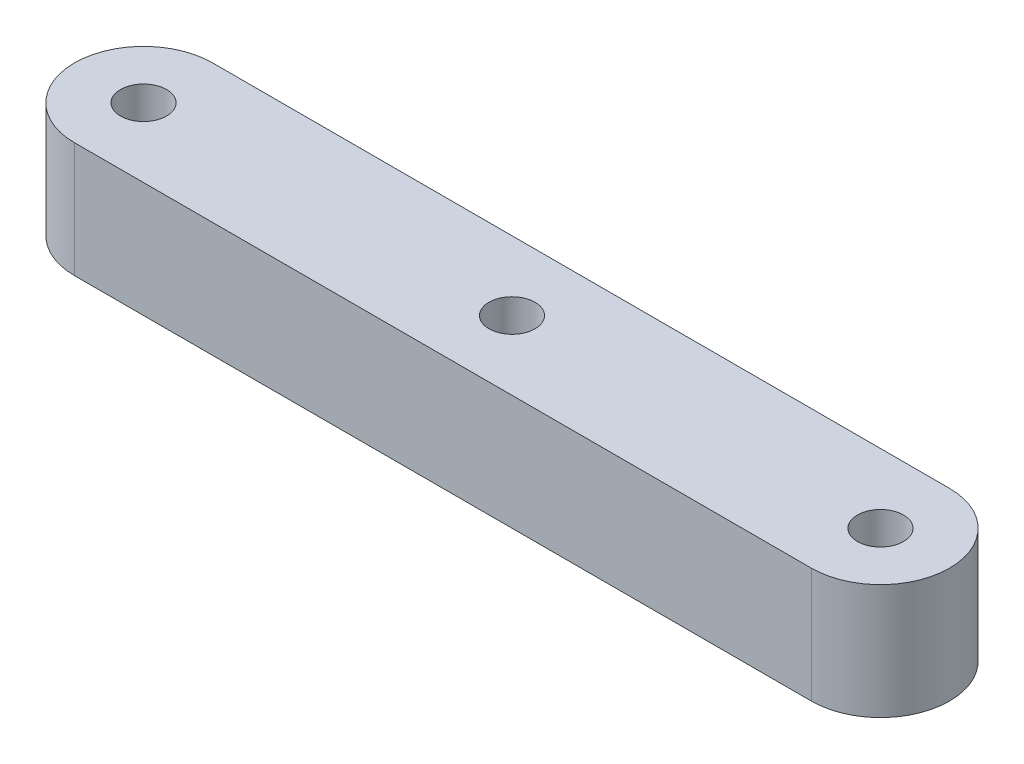
ISO-10303-21;
HEADER;
FILE_DESCRIPTION(('STEP AP214'),'2;1');
FILE_NAME('part.step','',(''),(''),'','','');
FILE_SCHEMA(('AUTOMOTIVE_DESIGN { 1 0 10303 214 1 1 1 1 }'));
ENDSEC;
DATA;
#1=APPLICATION_CONTEXT('core data for automotive mechanical design processes');
#2=APPLICATION_PROTOCOL_DEFINITION('international standard','automotive_design',2000,#1);
#3=PRODUCT_CONTEXT('',#1,'mechanical');
#4=PRODUCT('Part','Part','',(#3));
#5=PRODUCT_RELATED_PRODUCT_CATEGORY('part','',(#4));
#6=PRODUCT_DEFINITION_FORMATION('','',#4);
#7=PRODUCT_DEFINITION_CONTEXT('part definition',#1,'design');
#8=PRODUCT_DEFINITION('design','',#6,#7);
#9=PRODUCT_DEFINITION_SHAPE('','',#8);
#10=(LENGTH_UNIT() NAMED_UNIT(*) SI_UNIT(.MILLI.,.METRE.));
#11=(NAMED_UNIT(*) PLANE_ANGLE_UNIT() SI_UNIT($,.RADIAN.));
#12=(NAMED_UNIT(*) SI_UNIT($,.STERADIAN.) SOLID_ANGLE_UNIT());
#13=UNCERTAINTY_MEASURE_WITH_UNIT(LENGTH_MEASURE(1.E-05),#10,'distance_accuracy_value','');
#14=(GEOMETRIC_REPRESENTATION_CONTEXT(3) GLOBAL_UNCERTAINTY_ASSIGNED_CONTEXT((#13)) GLOBAL_UNIT_ASSIGNED_CONTEXT((#10,
#11,#12)) REPRESENTATION_CONTEXT('',''));
#15=CARTESIAN_POINT('',(0.,0.,0.));
#16=DIRECTION('',(0.,0.,1.));
#17=DIRECTION('',(1.,0.,0.));
#18=AXIS2_PLACEMENT_3D('',#15,#16,#17);
#19=CARTESIAN_POINT('',(-50.8,12.7,0.));
#20=DIRECTION('',(0.,-1.,0.));
#21=DIRECTION('',(0.,0.,-1.));
#22=AXIS2_PLACEMENT_3D('',#19,#20,#21);
#23=CYLINDRICAL_SURFACE('',#22,7.62);
#24=CARTESIAN_POINT('',(-50.8,0.,0.));
#25=DIRECTION('',(0.,1.,0.));
#26=DIRECTION('',(0.,0.,1.));
#27=AXIS2_PLACEMENT_3D('',#24,#25,#26);
#28=CIRCLE('',#27,7.62);
#29=CARTESIAN_POINT('',(-50.8,0.,-7.62));
#30=VERTEX_POINT('',#29);
#31=CARTESIAN_POINT('',(-50.8,0.,7.62));
#32=VERTEX_POINT('',#31);
#33=EDGE_CURVE('E102',#30,#32,#28,.T.);
#34=ORIENTED_EDGE('',*,*,#33,.T.);
#35=DIRECTION('',(0.,-1.,0.));
#36=VECTOR('',#35,1.);
#37=CARTESIAN_POINT('',(-50.8,12.7,7.62));
#38=LINE('',#37,#36);
#39=CARTESIAN_POINT('',(-50.8,12.7,7.62));
#40=VERTEX_POINT('',#39);
#41=EDGE_CURVE('E11',#40,#32,#38,.T.);
#42=ORIENTED_EDGE('',*,*,#41,.F.);
#43=CARTESIAN_POINT('',(-50.8,12.7,0.));
#44=DIRECTION('',(0.,1.,0.));
#45=DIRECTION('',(0.,0.,1.));
#46=AXIS2_PLACEMENT_3D('',#43,#44,#45);
#47=CIRCLE('',#46,7.62);
#48=CARTESIAN_POINT('',(-50.8,12.7,-7.62));
#49=VERTEX_POINT('',#48);
#50=EDGE_CURVE('E90',#49,#40,#47,.T.);
#51=ORIENTED_EDGE('',*,*,#50,.F.);
#52=DIRECTION('',(0.,-1.,0.));
#53=VECTOR('',#52,1.);
#54=CARTESIAN_POINT('',(-50.8,12.7,-7.62));
#55=LINE('',#54,#53);
#56=EDGE_CURVE('E98',#49,#30,#55,.T.);
#57=ORIENTED_EDGE('',*,*,#56,.T.);
#58=EDGE_LOOP('',(#34,#42,#51,#57));
#59=FACE_BOUND('',#58,.T.);
#60=ADVANCED_FACE('F39',(#59),#23,.T.);
#61=CARTESIAN_POINT('',(-50.8,12.7,7.62));
#62=DIRECTION('',(0.,0.,-1.));
#63=DIRECTION('',(-1.,0.,0.));
#64=AXIS2_PLACEMENT_3D('',#61,#62,#63);
#65=PLANE('',#64);
#66=DIRECTION('',(1.,0.,0.));
#67=VECTOR('',#66,1.);
#68=CARTESIAN_POINT('',(-50.8,0.,7.62));
#69=LINE('',#68,#67);
#70=CARTESIAN_POINT('',(30.48,0.,7.62));
#71=VERTEX_POINT('',#70);
#72=EDGE_CURVE('E94',#32,#71,#69,.T.);
#73=ORIENTED_EDGE('',*,*,#72,.T.);
#74=DIRECTION('',(0.,-1.,0.));
#75=VECTOR('',#74,1.);
#76=CARTESIAN_POINT('',(30.48,12.7,7.62));
#77=LINE('',#76,#75);
#78=CARTESIAN_POINT('',(30.48,12.7,7.62));
#79=VERTEX_POINT('',#78);
#80=EDGE_CURVE('E47',#79,#71,#77,.T.);
#81=ORIENTED_EDGE('',*,*,#80,.F.);
#82=DIRECTION('',(1.,0.,0.));
#83=VECTOR('',#82,1.);
#84=CARTESIAN_POINT('',(-50.8,12.7,7.62));
#85=LINE('',#84,#83);
#86=EDGE_CURVE('E85',#40,#79,#85,.T.);
#87=ORIENTED_EDGE('',*,*,#86,.F.);
#88=ORIENTED_EDGE('',*,*,#41,.T.);
#89=EDGE_LOOP('',(#73,#81,#87,#88));
#90=FACE_BOUND('',#89,.T.);
#91=ADVANCED_FACE('F93',(#90),#65,.F.);
#92=CARTESIAN_POINT('',(30.48,12.7,0.));
#93=DIRECTION('',(0.,-1.,0.));
#94=DIRECTION('',(0.,0.,-1.));
#95=AXIS2_PLACEMENT_3D('',#92,#93,#94);
#96=CYLINDRICAL_SURFACE('',#95,7.62);
#97=CARTESIAN_POINT('',(30.48,0.,0.));
#98=DIRECTION('',(0.,1.,0.));
#99=DIRECTION('',(0.,0.,1.));
#100=AXIS2_PLACEMENT_3D('',#97,#98,#99);
#101=CIRCLE('',#100,7.62);
#102=CARTESIAN_POINT('',(30.48,0.,-7.62));
#103=VERTEX_POINT('',#102);
#104=EDGE_CURVE('E72',#71,#103,#101,.T.);
#105=ORIENTED_EDGE('',*,*,#104,.T.);
#106=DIRECTION('',(0.,-1.,0.));
#107=VECTOR('',#106,1.);
#108=CARTESIAN_POINT('',(30.48,12.7,-7.62));
#109=LINE('',#108,#107);
#110=CARTESIAN_POINT('',(30.48,12.7,-7.62));
#111=VERTEX_POINT('',#110);
#112=EDGE_CURVE('E95',#111,#103,#109,.T.);
#113=ORIENTED_EDGE('',*,*,#112,.F.);
#114=CARTESIAN_POINT('',(30.48,12.7,0.));
#115=DIRECTION('',(0.,1.,0.));
#116=DIRECTION('',(0.,0.,1.));
#117=AXIS2_PLACEMENT_3D('',#114,#115,#116);
#118=CIRCLE('',#117,7.62);
#119=EDGE_CURVE('E88',#79,#111,#118,.T.);
#120=ORIENTED_EDGE('',*,*,#119,.F.);
#121=ORIENTED_EDGE('',*,*,#80,.T.);
#122=EDGE_LOOP('',(#105,#113,#120,#121));
#123=FACE_BOUND('',#122,.T.);
#124=ADVANCED_FACE('F96',(#123),#96,.T.);
#125=CARTESIAN_POINT('',(-50.8,12.7,-7.62));
#126=DIRECTION('',(0.,0.,1.));
#127=DIRECTION('',(1.,0.,0.));
#128=AXIS2_PLACEMENT_3D('',#125,#126,#127);
#129=PLANE('',#128);
#130=DIRECTION('',(-1.,0.,0.));
#131=VECTOR('',#130,1.);
#132=CARTESIAN_POINT('',(-50.8,0.,-7.62));
#133=LINE('',#132,#131);
#134=EDGE_CURVE('E78',#103,#30,#133,.T.);
#135=ORIENTED_EDGE('',*,*,#134,.T.);
#136=ORIENTED_EDGE('',*,*,#56,.F.);
#137=DIRECTION('',(-1.,0.,0.));
#138=VECTOR('',#137,1.);
#139=CARTESIAN_POINT('',(-50.8,12.7,-7.62));
#140=LINE('',#139,#138);
#141=EDGE_CURVE('E55',#111,#49,#140,.T.);
#142=ORIENTED_EDGE('',*,*,#141,.F.);
#143=ORIENTED_EDGE('',*,*,#112,.T.);
#144=EDGE_LOOP('',(#135,#136,#142,#143));
#145=FACE_BOUND('',#144,.T.);
#146=ADVANCED_FACE('F110',(#145),#129,.F.);
#147=CARTESIAN_POINT('',(-50.8,12.7,0.));
#148=DIRECTION('',(0.,1.,0.));
#149=DIRECTION('',(0.,0.,1.));
#150=AXIS2_PLACEMENT_3D('',#147,#148,#149);
#151=PLANE('',#150);
#152=CARTESIAN_POINT('',(-50.8,12.7,0.));
#153=DIRECTION('',(0.,1.,0.));
#154=DIRECTION('',(0.,0.,1.));
#155=AXIS2_PLACEMENT_3D('',#152,#153,#154);
#156=CIRCLE('',#155,2.54);
#157=CARTESIAN_POINT('',(-50.8,12.7,2.54));
#158=VERTEX_POINT('',#157);
#159=EDGE_CURVE('E128',#158,#158,#156,.T.);
#160=ORIENTED_EDGE('',*,*,#159,.F.);
#161=EDGE_LOOP('',(#160));
#162=FACE_BOUND('',#161,.T.);
#163=CARTESIAN_POINT('',(30.48,12.7,0.));
#164=DIRECTION('',(0.,1.,0.));
#165=DIRECTION('',(0.,0.,-1.));
#166=AXIS2_PLACEMENT_3D('',#163,#164,#165);
#167=CIRCLE('',#166,2.54);
#168=CARTESIAN_POINT('',(30.48,12.7,-2.54));
#169=VERTEX_POINT('',#168);
#170=EDGE_CURVE('E125',#169,#169,#167,.T.);
#171=ORIENTED_EDGE('',*,*,#170,.F.);
#172=EDGE_LOOP('',(#171));
#173=FACE_BOUND('',#172,.T.);
#174=CARTESIAN_POINT('',(-10.16,12.7,0.));
#175=DIRECTION('',(0.,1.,0.));
#176=DIRECTION('',(0.,0.,1.));
#177=AXIS2_PLACEMENT_3D('',#174,#175,#176);
#178=CIRCLE('',#177,2.54);
#179=CARTESIAN_POINT('',(-10.16,12.7,2.54));
#180=VERTEX_POINT('',#179);
#181=EDGE_CURVE('E119',#180,#180,#178,.T.);
#182=ORIENTED_EDGE('',*,*,#181,.F.);
#183=EDGE_LOOP('',(#182));
#184=FACE_BOUND('',#183,.T.);
#185=ORIENTED_EDGE('',*,*,#50,.T.);
#186=ORIENTED_EDGE('',*,*,#86,.T.);
#187=ORIENTED_EDGE('',*,*,#119,.T.);
#188=ORIENTED_EDGE('',*,*,#141,.T.);
#189=EDGE_LOOP('',(#185,#186,#187,#188));
#190=FACE_BOUND('',#189,.T.);
#191=ADVANCED_FACE('F86',(#162,#173,#184,#190),#151,.T.);
#192=CARTESIAN_POINT('',(-50.8,0.,0.));
#193=DIRECTION('',(0.,1.,0.));
#194=DIRECTION('',(0.,0.,1.));
#195=AXIS2_PLACEMENT_3D('',#192,#193,#194);
#196=PLANE('',#195);
#197=CARTESIAN_POINT('',(-50.8,0.,0.));
#198=DIRECTION('',(0.,1.,0.));
#199=DIRECTION('',(0.,0.,1.));
#200=AXIS2_PLACEMENT_3D('',#197,#198,#199);
#201=CIRCLE('',#200,2.54);
#202=CARTESIAN_POINT('',(-50.8,0.,2.54));
#203=VERTEX_POINT('',#202);
#204=EDGE_CURVE('E105',#203,#203,#201,.T.);
#205=ORIENTED_EDGE('',*,*,#204,.T.);
#206=EDGE_LOOP('',(#205));
#207=FACE_BOUND('',#206,.T.);
#208=CARTESIAN_POINT('',(30.48,0.,0.));
#209=DIRECTION('',(0.,1.,0.));
#210=DIRECTION('',(0.,0.,-1.));
#211=AXIS2_PLACEMENT_3D('',#208,#209,#210);
#212=CIRCLE('',#211,2.54);
#213=CARTESIAN_POINT('',(30.48,0.,-2.54));
#214=VERTEX_POINT('',#213);
#215=EDGE_CURVE('E122',#214,#214,#212,.T.);
#216=ORIENTED_EDGE('',*,*,#215,.T.);
#217=EDGE_LOOP('',(#216));
#218=FACE_BOUND('',#217,.T.);
#219=CARTESIAN_POINT('',(-10.16,0.,0.));
#220=DIRECTION('',(0.,1.,0.));
#221=DIRECTION('',(0.,0.,1.));
#222=AXIS2_PLACEMENT_3D('',#219,#220,#221);
#223=CIRCLE('',#222,2.54);
#224=CARTESIAN_POINT('',(-10.16,0.,2.54));
#225=VERTEX_POINT('',#224);
#226=EDGE_CURVE('E116',#225,#225,#223,.T.);
#227=ORIENTED_EDGE('',*,*,#226,.T.);
#228=EDGE_LOOP('',(#227));
#229=FACE_BOUND('',#228,.T.);
#230=ORIENTED_EDGE('',*,*,#33,.F.);
#231=ORIENTED_EDGE('',*,*,#134,.F.);
#232=ORIENTED_EDGE('',*,*,#104,.F.);
#233=ORIENTED_EDGE('',*,*,#72,.F.);
#234=EDGE_LOOP('',(#230,#231,#232,#233));
#235=FACE_BOUND('',#234,.T.);
#236=ADVANCED_FACE('F113',(#207,#218,#229,#235),#196,.F.);
#237=CARTESIAN_POINT('',(-10.16,0.,0.));
#238=DIRECTION('',(0.,1.,0.));
#239=DIRECTION('',(0.,0.,1.));
#240=AXIS2_PLACEMENT_3D('',#237,#238,#239);
#241=CYLINDRICAL_SURFACE('',#240,2.54);
#242=ORIENTED_EDGE('',*,*,#226,.F.);
#243=EDGE_LOOP('',(#242));
#244=FACE_BOUND('',#243,.T.);
#245=ORIENTED_EDGE('',*,*,#181,.T.);
#246=EDGE_LOOP('',(#245));
#247=FACE_BOUND('',#246,.T.);
#248=ADVANCED_FACE('F150',(#244,#247),#241,.F.);
#249=CARTESIAN_POINT('',(30.48,0.,0.));
#250=DIRECTION('',(0.,1.,0.));
#251=DIRECTION('',(0.,0.,1.));
#252=AXIS2_PLACEMENT_3D('',#249,#250,#251);
#253=CYLINDRICAL_SURFACE('',#252,2.54);
#254=ORIENTED_EDGE('',*,*,#215,.F.);
#255=EDGE_LOOP('',(#254));
#256=FACE_BOUND('',#255,.T.);
#257=ORIENTED_EDGE('',*,*,#170,.T.);
#258=EDGE_LOOP('',(#257));
#259=FACE_BOUND('',#258,.T.);
#260=ADVANCED_FACE('F139',(#256,#259),#253,.F.);
#261=CARTESIAN_POINT('',(-50.8,0.,0.));
#262=DIRECTION('',(0.,1.,0.));
#263=DIRECTION('',(0.,0.,1.));
#264=AXIS2_PLACEMENT_3D('',#261,#262,#263);
#265=CYLINDRICAL_SURFACE('',#264,2.54);
#266=ORIENTED_EDGE('',*,*,#204,.F.);
#267=EDGE_LOOP('',(#266));
#268=FACE_BOUND('',#267,.T.);
#269=ORIENTED_EDGE('',*,*,#159,.T.);
#270=EDGE_LOOP('',(#269));
#271=FACE_BOUND('',#270,.T.);
#272=ADVANCED_FACE('F136',(#268,#271),#265,.F.);
#273=CLOSED_SHELL('',(#60,#91,#124,#146,#191,#236,#248,#260,#272));
#274=MANIFOLD_SOLID_BREP('B2',#273);
#275=ADVANCED_BREP_SHAPE_REPRESENTATION('',(#18,#274),#14);
#276=SHAPE_DEFINITION_REPRESENTATION(#9,#275);
ENDSEC;
END-ISO-10303-21;
